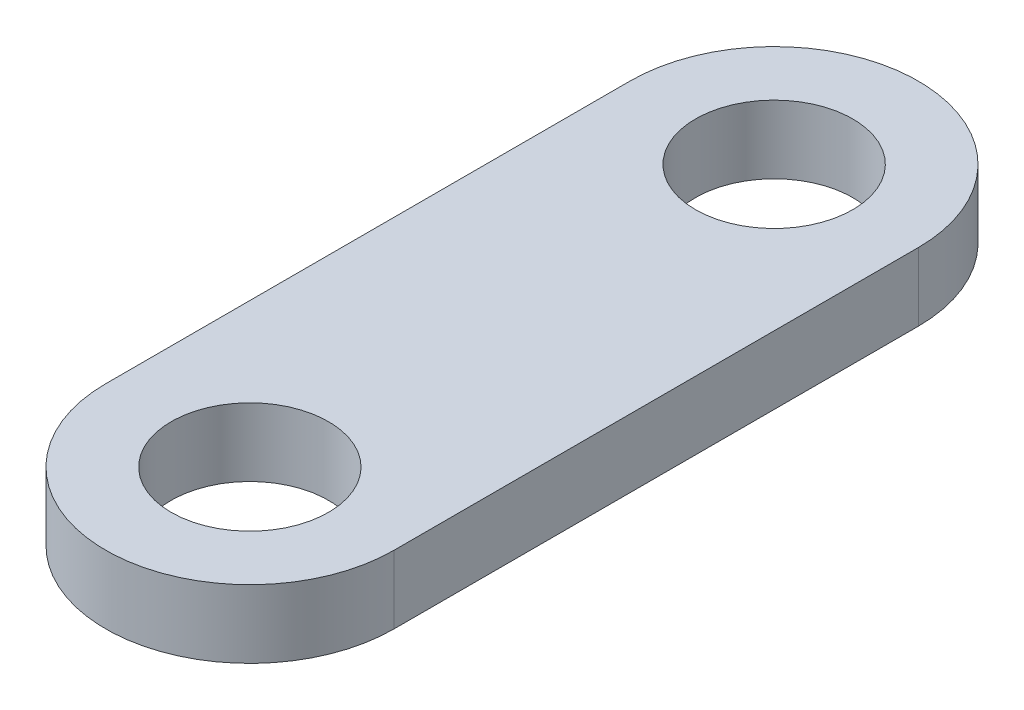
ISO-10303-21;
HEADER;
FILE_DESCRIPTION(('STEP AP214'),'2;1');
FILE_NAME('part.step','',(''),(''),'','','');
FILE_SCHEMA(('AUTOMOTIVE_DESIGN { 1 0 10303 214 1 1 1 1 }'));
ENDSEC;
DATA;
#1=APPLICATION_CONTEXT('core data for automotive mechanical design processes');
#2=APPLICATION_PROTOCOL_DEFINITION('international standard','automotive_design',2000,#1);
#3=PRODUCT_CONTEXT('',#1,'mechanical');
#4=PRODUCT('Part','Part','',(#3));
#5=PRODUCT_RELATED_PRODUCT_CATEGORY('part','',(#4));
#6=PRODUCT_DEFINITION_FORMATION('','',#4);
#7=PRODUCT_DEFINITION_CONTEXT('part definition',#1,'design');
#8=PRODUCT_DEFINITION('design','',#6,#7);
#9=PRODUCT_DEFINITION_SHAPE('','',#8);
#10=(LENGTH_UNIT() NAMED_UNIT(*) SI_UNIT(.MILLI.,.METRE.));
#11=(NAMED_UNIT(*) PLANE_ANGLE_UNIT() SI_UNIT($,.RADIAN.));
#12=(NAMED_UNIT(*) SI_UNIT($,.STERADIAN.) SOLID_ANGLE_UNIT());
#13=UNCERTAINTY_MEASURE_WITH_UNIT(LENGTH_MEASURE(1.E-05),#10,'distance_accuracy_value','');
#14=(GEOMETRIC_REPRESENTATION_CONTEXT(3) GLOBAL_UNCERTAINTY_ASSIGNED_CONTEXT((#13)) GLOBAL_UNIT_ASSIGNED_CONTEXT((#10,
#11,#12)) REPRESENTATION_CONTEXT('',''));
#15=CARTESIAN_POINT('',(0.,0.,0.));
#16=DIRECTION('',(0.,0.,1.));
#17=DIRECTION('',(1.,0.,0.));
#18=AXIS2_PLACEMENT_3D('',#15,#16,#17);
#19=CARTESIAN_POINT('',(0.,2.6,10.));
#20=DIRECTION('',(0.,1.,0.));
#21=DIRECTION('',(0.,0.,1.));
#22=AXIS2_PLACEMENT_3D('',#19,#20,#21);
#23=PLANE('',#22);
#24=CARTESIAN_POINT('',(0.,2.6,-10.));
#25=DIRECTION('',(0.,1.,0.));
#26=DIRECTION('',(0.,0.,1.));
#27=AXIS2_PLACEMENT_3D('',#24,#25,#26);
#28=CIRCLE('',#27,3.);
#29=CARTESIAN_POINT('',(0.,2.6,-7.));
#30=VERTEX_POINT('',#29);
#31=EDGE_CURVE('E117',#30,#30,#28,.T.);
#32=ORIENTED_EDGE('',*,*,#31,.F.);
#33=EDGE_LOOP('',(#32));
#34=FACE_BOUND('',#33,.T.);
#35=CARTESIAN_POINT('',(0.,2.6,10.));
#36=DIRECTION('',(0.,1.,0.));
#37=DIRECTION('',(0.,0.,1.));
#38=AXIS2_PLACEMENT_3D('',#35,#36,#37);
#39=CIRCLE('',#38,5.5);
#40=CARTESIAN_POINT('',(-5.5,2.6,10.));
#41=VERTEX_POINT('',#40);
#42=CARTESIAN_POINT('',(5.5,2.6,10.));
#43=VERTEX_POINT('',#42);
#44=EDGE_CURVE('E98',#41,#43,#39,.T.);
#45=ORIENTED_EDGE('',*,*,#44,.T.);
#46=DIRECTION('',(0.,0.,-1.));
#47=VECTOR('',#46,1.);
#48=CARTESIAN_POINT('',(5.5,2.6,10.));
#49=LINE('',#48,#47);
#50=CARTESIAN_POINT('',(5.5,2.6,-10.));
#51=VERTEX_POINT('',#50);
#52=EDGE_CURVE('E91',#43,#51,#49,.T.);
#53=ORIENTED_EDGE('',*,*,#52,.T.);
#54=CARTESIAN_POINT('',(0.,2.6,-10.));
#55=DIRECTION('',(0.,1.,0.));
#56=DIRECTION('',(0.,0.,1.));
#57=AXIS2_PLACEMENT_3D('',#54,#55,#56);
#58=CIRCLE('',#57,5.5);
#59=CARTESIAN_POINT('',(-5.5,2.6,-10.));
#60=VERTEX_POINT('',#59);
#61=EDGE_CURVE('E96',#51,#60,#58,.T.);
#62=ORIENTED_EDGE('',*,*,#61,.T.);
#63=DIRECTION('',(0.,0.,1.));
#64=VECTOR('',#63,1.);
#65=CARTESIAN_POINT('',(-5.5,2.6,10.));
#66=LINE('',#65,#64);
#67=EDGE_CURVE('E62',#60,#41,#66,.T.);
#68=ORIENTED_EDGE('',*,*,#67,.T.);
#69=EDGE_LOOP('',(#45,#53,#62,#68));
#70=FACE_BOUND('',#69,.T.);
#71=CARTESIAN_POINT('',(0.,2.6,10.));
#72=DIRECTION('',(0.,1.,0.));
#73=DIRECTION('',(0.,0.,1.));
#74=AXIS2_PLACEMENT_3D('',#71,#72,#73);
#75=CIRCLE('',#74,3.);
#76=CARTESIAN_POINT('',(0.,2.6,13.));
#77=VERTEX_POINT('',#76);
#78=EDGE_CURVE('E138',#77,#77,#75,.T.);
#79=ORIENTED_EDGE('',*,*,#78,.F.);
#80=EDGE_LOOP('',(#79));
#81=FACE_BOUND('',#80,.T.);
#82=ADVANCED_FACE('F44',(#34,#70,#81),#23,.T.);
#83=CARTESIAN_POINT('',(0.,0.,10.));
#84=DIRECTION('',(0.,1.,0.));
#85=DIRECTION('',(0.,0.,1.));
#86=AXIS2_PLACEMENT_3D('',#83,#84,#85);
#87=PLANE('',#86);
#88=CARTESIAN_POINT('',(0.,0.,10.));
#89=DIRECTION('',(0.,1.,0.));
#90=DIRECTION('',(0.,0.,1.));
#91=AXIS2_PLACEMENT_3D('',#88,#89,#90);
#92=CIRCLE('',#91,5.5);
#93=CARTESIAN_POINT('',(-5.5,0.,10.));
#94=VERTEX_POINT('',#93);
#95=CARTESIAN_POINT('',(5.5,0.,10.));
#96=VERTEX_POINT('',#95);
#97=EDGE_CURVE('E111',#94,#96,#92,.T.);
#98=ORIENTED_EDGE('',*,*,#97,.F.);
#99=DIRECTION('',(0.,0.,1.));
#100=VECTOR('',#99,1.);
#101=CARTESIAN_POINT('',(-5.5,0.,10.));
#102=LINE('',#101,#100);
#103=CARTESIAN_POINT('',(-5.5,0.,-10.));
#104=VERTEX_POINT('',#103);
#105=EDGE_CURVE('E88',#104,#94,#102,.T.);
#106=ORIENTED_EDGE('',*,*,#105,.F.);
#107=CARTESIAN_POINT('',(0.,0.,-10.));
#108=DIRECTION('',(0.,1.,0.));
#109=DIRECTION('',(0.,0.,1.));
#110=AXIS2_PLACEMENT_3D('',#107,#108,#109);
#111=CIRCLE('',#110,5.5);
#112=CARTESIAN_POINT('',(5.5,0.,-10.));
#113=VERTEX_POINT('',#112);
#114=EDGE_CURVE('E79',#113,#104,#111,.T.);
#115=ORIENTED_EDGE('',*,*,#114,.F.);
#116=DIRECTION('',(0.,0.,-1.));
#117=VECTOR('',#116,1.);
#118=CARTESIAN_POINT('',(5.5,0.,10.));
#119=LINE('',#118,#117);
#120=EDGE_CURVE('E103',#96,#113,#119,.T.);
#121=ORIENTED_EDGE('',*,*,#120,.F.);
#122=EDGE_LOOP('',(#98,#106,#115,#121));
#123=FACE_BOUND('',#122,.T.);
#124=CARTESIAN_POINT('',(0.,0.,-10.));
#125=DIRECTION('',(0.,1.,0.));
#126=DIRECTION('',(0.,0.,1.));
#127=AXIS2_PLACEMENT_3D('',#124,#125,#126);
#128=CIRCLE('',#127,3.);
#129=CARTESIAN_POINT('',(0.,0.,-7.));
#130=VERTEX_POINT('',#129);
#131=EDGE_CURVE('E137',#130,#130,#128,.T.);
#132=ORIENTED_EDGE('',*,*,#131,.T.);
#133=EDGE_LOOP('',(#132));
#134=FACE_BOUND('',#133,.T.);
#135=CARTESIAN_POINT('',(0.,0.,10.));
#136=DIRECTION('',(0.,1.,0.));
#137=DIRECTION('',(0.,0.,1.));
#138=AXIS2_PLACEMENT_3D('',#135,#136,#137);
#139=CIRCLE('',#138,3.);
#140=CARTESIAN_POINT('',(0.,0.,13.));
#141=VERTEX_POINT('',#140);
#142=EDGE_CURVE('E145',#141,#141,#139,.T.);
#143=ORIENTED_EDGE('',*,*,#142,.T.);
#144=EDGE_LOOP('',(#143));
#145=FACE_BOUND('',#144,.T.);
#146=ADVANCED_FACE('F131',(#123,#134,#145),#87,.F.);
#147=CARTESIAN_POINT('',(0.,2.6,10.));
#148=DIRECTION('',(0.,-1.,0.));
#149=DIRECTION('',(0.,0.,-1.));
#150=AXIS2_PLACEMENT_3D('',#147,#148,#149);
#151=CYLINDRICAL_SURFACE('',#150,5.5);
#152=ORIENTED_EDGE('',*,*,#97,.T.);
#153=DIRECTION('',(0.,-1.,0.));
#154=VECTOR('',#153,1.);
#155=CARTESIAN_POINT('',(5.5,2.6,10.));
#156=LINE('',#155,#154);
#157=EDGE_CURVE('E11',#43,#96,#156,.T.);
#158=ORIENTED_EDGE('',*,*,#157,.F.);
#159=ORIENTED_EDGE('',*,*,#44,.F.);
#160=DIRECTION('',(0.,-1.,0.));
#161=VECTOR('',#160,1.);
#162=CARTESIAN_POINT('',(-5.5,2.6,10.));
#163=LINE('',#162,#161);
#164=EDGE_CURVE('E109',#41,#94,#163,.T.);
#165=ORIENTED_EDGE('',*,*,#164,.T.);
#166=EDGE_LOOP('',(#152,#158,#159,#165));
#167=FACE_BOUND('',#166,.T.);
#168=ADVANCED_FACE('F50',(#167),#151,.T.);
#169=CARTESIAN_POINT('',(5.5,2.6,10.));
#170=DIRECTION('',(-1.,0.,0.));
#171=DIRECTION('',(0.,0.,1.));
#172=AXIS2_PLACEMENT_3D('',#169,#170,#171);
#173=PLANE('',#172);
#174=ORIENTED_EDGE('',*,*,#120,.T.);
#175=DIRECTION('',(0.,-1.,0.));
#176=VECTOR('',#175,1.);
#177=CARTESIAN_POINT('',(5.5,2.6,-10.));
#178=LINE('',#177,#176);
#179=EDGE_CURVE('E54',#51,#113,#178,.T.);
#180=ORIENTED_EDGE('',*,*,#179,.F.);
#181=ORIENTED_EDGE('',*,*,#52,.F.);
#182=ORIENTED_EDGE('',*,*,#157,.T.);
#183=EDGE_LOOP('',(#174,#180,#181,#182));
#184=FACE_BOUND('',#183,.T.);
#185=ADVANCED_FACE('F105',(#184),#173,.F.);
#186=CARTESIAN_POINT('',(0.,2.6,-10.));
#187=DIRECTION('',(0.,-1.,0.));
#188=DIRECTION('',(0.,0.,-1.));
#189=AXIS2_PLACEMENT_3D('',#186,#187,#188);
#190=CYLINDRICAL_SURFACE('',#189,5.5);
#191=ORIENTED_EDGE('',*,*,#114,.T.);
#192=DIRECTION('',(0.,-1.,0.));
#193=VECTOR('',#192,1.);
#194=CARTESIAN_POINT('',(-5.5,2.6,-10.));
#195=LINE('',#194,#193);
#196=EDGE_CURVE('E104',#60,#104,#195,.T.);
#197=ORIENTED_EDGE('',*,*,#196,.F.);
#198=ORIENTED_EDGE('',*,*,#61,.F.);
#199=ORIENTED_EDGE('',*,*,#179,.T.);
#200=EDGE_LOOP('',(#191,#197,#198,#199));
#201=FACE_BOUND('',#200,.T.);
#202=ADVANCED_FACE('F106',(#201),#190,.T.);
#203=CARTESIAN_POINT('',(-5.5,2.6,10.));
#204=DIRECTION('',(1.,0.,0.));
#205=DIRECTION('',(0.,0.,-1.));
#206=AXIS2_PLACEMENT_3D('',#203,#204,#205);
#207=PLANE('',#206);
#208=ORIENTED_EDGE('',*,*,#105,.T.);
#209=ORIENTED_EDGE('',*,*,#164,.F.);
#210=ORIENTED_EDGE('',*,*,#67,.F.);
#211=ORIENTED_EDGE('',*,*,#196,.T.);
#212=EDGE_LOOP('',(#208,#209,#210,#211));
#213=FACE_BOUND('',#212,.T.);
#214=ADVANCED_FACE('F126',(#213),#207,.F.);
#215=CARTESIAN_POINT('',(0.,2.6,-10.));
#216=DIRECTION('',(0.,-1.,0.));
#217=DIRECTION('',(0.,0.,-1.));
#218=AXIS2_PLACEMENT_3D('',#215,#216,#217);
#219=CYLINDRICAL_SURFACE('',#218,3.);
#220=ORIENTED_EDGE('',*,*,#31,.T.);
#221=EDGE_LOOP('',(#220));
#222=FACE_BOUND('',#221,.T.);
#223=ORIENTED_EDGE('',*,*,#131,.F.);
#224=EDGE_LOOP('',(#223));
#225=FACE_BOUND('',#224,.T.);
#226=ADVANCED_FACE('F162',(#222,#225),#219,.F.);
#227=CARTESIAN_POINT('',(0.,2.6,10.));
#228=DIRECTION('',(0.,-1.,0.));
#229=DIRECTION('',(0.,0.,-1.));
#230=AXIS2_PLACEMENT_3D('',#227,#228,#229);
#231=CYLINDRICAL_SURFACE('',#230,3.);
#232=ORIENTED_EDGE('',*,*,#78,.T.);
#233=EDGE_LOOP('',(#232));
#234=FACE_BOUND('',#233,.T.);
#235=ORIENTED_EDGE('',*,*,#142,.F.);
#236=EDGE_LOOP('',(#235));
#237=FACE_BOUND('',#236,.T.);
#238=ADVANCED_FACE('F155',(#234,#237),#231,.F.);
#239=CLOSED_SHELL('',(#82,#146,#168,#185,#202,#214,#226,#238));
#240=MANIFOLD_SOLID_BREP('B2',#239);
#241=ADVANCED_BREP_SHAPE_REPRESENTATION('',(#18,#240),#14);
#242=SHAPE_DEFINITION_REPRESENTATION(#9,#241);
ENDSEC;
END-ISO-10303-21;
